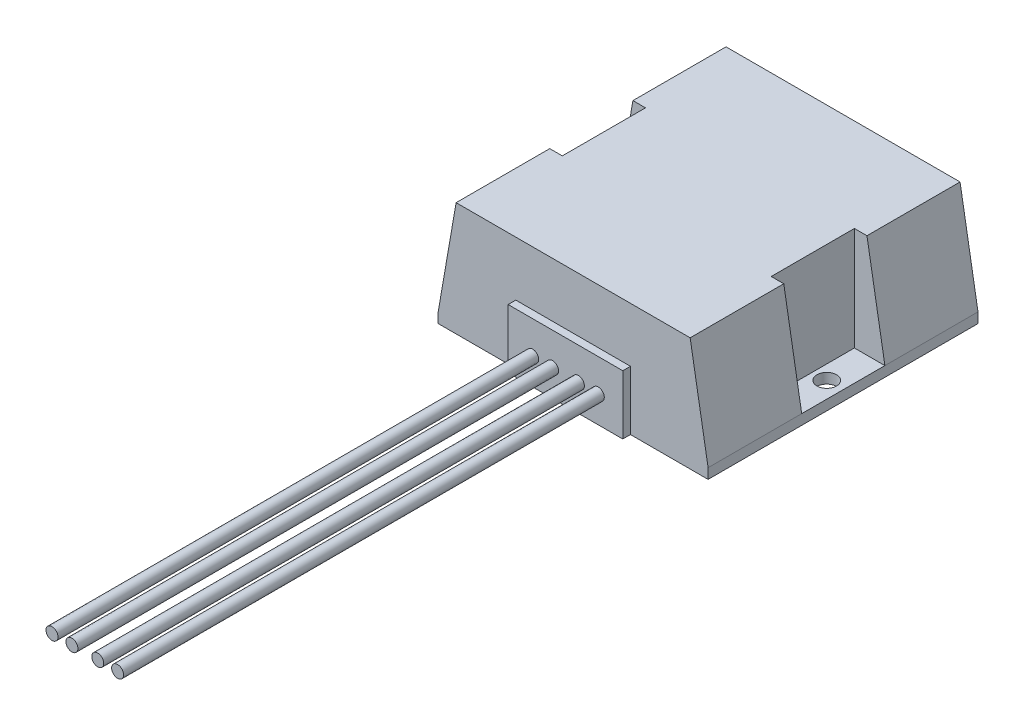
ISO-10303-21;
HEADER;
FILE_DESCRIPTION(('STEP AP214'),'2;1');
FILE_NAME('part.step','',(''),(''),'','','');
FILE_SCHEMA(('AUTOMOTIVE_DESIGN { 1 0 10303 214 1 1 1 1 }'));
ENDSEC;
DATA;
#1=APPLICATION_CONTEXT('core data for automotive mechanical design processes');
#2=APPLICATION_PROTOCOL_DEFINITION('international standard','automotive_design',2000,#1);
#3=PRODUCT_CONTEXT('',#1,'mechanical');
#4=PRODUCT('Part','Part','',(#3));
#5=PRODUCT_RELATED_PRODUCT_CATEGORY('part','',(#4));
#6=PRODUCT_DEFINITION_FORMATION('','',#4);
#7=PRODUCT_DEFINITION_CONTEXT('part definition',#1,'design');
#8=PRODUCT_DEFINITION('design','',#6,#7);
#9=PRODUCT_DEFINITION_SHAPE('','',#8);
#10=(LENGTH_UNIT() NAMED_UNIT(*) SI_UNIT(.MILLI.,.METRE.));
#11=(NAMED_UNIT(*) PLANE_ANGLE_UNIT() SI_UNIT($,.RADIAN.));
#12=(NAMED_UNIT(*) SI_UNIT($,.STERADIAN.) SOLID_ANGLE_UNIT());
#13=UNCERTAINTY_MEASURE_WITH_UNIT(LENGTH_MEASURE(1.E-05),#10,'distance_accuracy_value','');
#14=(GEOMETRIC_REPRESENTATION_CONTEXT(3) GLOBAL_UNCERTAINTY_ASSIGNED_CONTEXT((#13)) GLOBAL_UNIT_ASSIGNED_CONTEXT((#10,
#11,#12)) REPRESENTATION_CONTEXT('',''));
#15=CARTESIAN_POINT('',(0.,0.,0.));
#16=DIRECTION('',(0.,0.,1.));
#17=DIRECTION('',(1.,0.,0.));
#18=AXIS2_PLACEMENT_3D('',#15,#16,#17);
#19=CARTESIAN_POINT('',(-9.017,7.366,171.2722));
#20=DIRECTION('',(0.,0.,-1.));
#21=DIRECTION('',(-1.,0.,0.));
#22=AXIS2_PLACEMENT_3D('',#19,#20,#21);
#23=CYLINDRICAL_SURFACE('',#22,1.651);
#24=CARTESIAN_POINT('',(-9.017,7.366,171.2722));
#25=DIRECTION('',(0.,0.,1.));
#26=DIRECTION('',(1.,0.,0.));
#27=AXIS2_PLACEMENT_3D('',#24,#25,#26);
#28=CIRCLE('',#27,1.651);
#29=CARTESIAN_POINT('',(-7.366,7.366,171.2722));
#30=VERTEX_POINT('',#29);
#31=EDGE_CURVE('E11',#30,#30,#28,.T.);
#32=ORIENTED_EDGE('',*,*,#31,.F.);
#33=EDGE_LOOP('',(#32));
#34=FACE_BOUND('',#33,.T.);
#35=CARTESIAN_POINT('',(-9.017,7.366,39.1922));
#36=DIRECTION('',(0.,0.,1.));
#37=DIRECTION('',(1.,0.,0.));
#38=AXIS2_PLACEMENT_3D('',#35,#36,#37);
#39=CIRCLE('',#38,1.651);
#40=CARTESIAN_POINT('',(-7.366,7.366,39.1922));
#41=VERTEX_POINT('',#40);
#42=EDGE_CURVE('E49',#41,#41,#39,.T.);
#43=ORIENTED_EDGE('',*,*,#42,.T.);
#44=EDGE_LOOP('',(#43));
#45=FACE_BOUND('',#44,.T.);
#46=ADVANCED_FACE('F46',(#34,#45),#23,.T.);
#47=CARTESIAN_POINT('',(-9.017,7.366,171.2722));
#48=DIRECTION('',(0.,0.,1.));
#49=DIRECTION('',(1.,0.,0.));
#50=AXIS2_PLACEMENT_3D('',#47,#48,#49);
#51=PLANE('',#50);
#52=ORIENTED_EDGE('',*,*,#31,.T.);
#53=EDGE_LOOP('',(#52));
#54=FACE_BOUND('',#53,.T.);
#55=ADVANCED_FACE('F61',(#54),#51,.T.);
#56=CARTESIAN_POINT('',(-9.017,7.366,39.1922));
#57=DIRECTION('',(0.,0.,1.));
#58=DIRECTION('',(1.,0.,0.));
#59=AXIS2_PLACEMENT_3D('',#56,#57,#58);
#60=PLANE('',#59);
#61=ORIENTED_EDGE('',*,*,#42,.F.);
#62=EDGE_LOOP('',(#61));
#63=FACE_BOUND('',#62,.T.);
#64=ADVANCED_FACE('F59',(#63),#60,.F.);
#65=CLOSED_SHELL('',(#46,#55,#64));
#66=MANIFOLD_SOLID_BREP('B2',#65);
#67=CARTESIAN_POINT('',(-3.556,7.366,171.2722));
#68=DIRECTION('',(0.,0.,-1.));
#69=DIRECTION('',(-1.,0.,0.));
#70=AXIS2_PLACEMENT_3D('',#67,#68,#69);
#71=CYLINDRICAL_SURFACE('',#70,1.651);
#72=CARTESIAN_POINT('',(-3.556,7.366,171.2722));
#73=DIRECTION('',(0.,0.,1.));
#74=DIRECTION('',(1.,0.,0.));
#75=AXIS2_PLACEMENT_3D('',#72,#73,#74);
#76=CIRCLE('',#75,1.651);
#77=CARTESIAN_POINT('',(-1.905,7.366,171.2722));
#78=VERTEX_POINT('',#77);
#79=EDGE_CURVE('E45',#78,#78,#76,.T.);
#80=ORIENTED_EDGE('',*,*,#79,.F.);
#81=EDGE_LOOP('',(#80));
#82=FACE_BOUND('',#81,.T.);
#83=CARTESIAN_POINT('',(-3.556,7.366,39.1922));
#84=DIRECTION('',(0.,0.,1.));
#85=DIRECTION('',(1.,0.,0.));
#86=AXIS2_PLACEMENT_3D('',#83,#84,#85);
#87=CIRCLE('',#86,1.651);
#88=CARTESIAN_POINT('',(-1.905,7.366,39.1922));
#89=VERTEX_POINT('',#88);
#90=EDGE_CURVE('E99',#89,#89,#87,.T.);
#91=ORIENTED_EDGE('',*,*,#90,.T.);
#92=EDGE_LOOP('',(#91));
#93=FACE_BOUND('',#92,.T.);
#94=ADVANCED_FACE('F96',(#82,#93),#71,.T.);
#95=CARTESIAN_POINT('',(-3.556,7.366,171.2722));
#96=DIRECTION('',(0.,0.,1.));
#97=DIRECTION('',(1.,0.,0.));
#98=AXIS2_PLACEMENT_3D('',#95,#96,#97);
#99=PLANE('',#98);
#100=ORIENTED_EDGE('',*,*,#79,.T.);
#101=EDGE_LOOP('',(#100));
#102=FACE_BOUND('',#101,.T.);
#103=ADVANCED_FACE('F111',(#102),#99,.T.);
#104=CARTESIAN_POINT('',(-3.556,7.366,39.1922));
#105=DIRECTION('',(0.,0.,1.));
#106=DIRECTION('',(1.,0.,0.));
#107=AXIS2_PLACEMENT_3D('',#104,#105,#106);
#108=PLANE('',#107);
#109=ORIENTED_EDGE('',*,*,#90,.F.);
#110=EDGE_LOOP('',(#109));
#111=FACE_BOUND('',#110,.T.);
#112=ADVANCED_FACE('F109',(#111),#108,.F.);
#113=CLOSED_SHELL('',(#94,#103,#112));
#114=MANIFOLD_SOLID_BREP('B6',#113);
#115=CARTESIAN_POINT('',(0.,0.,37.084));
#116=DIRECTION('',(0.,0.,-1.));
#117=DIRECTION('',(-1.,0.,0.));
#118=AXIS2_PLACEMENT_3D('',#115,#116,#117);
#119=PLANE('',#118);
#120=DIRECTION('',(0.,-1.,0.));
#121=VECTOR('',#120,1.);
#122=CARTESIAN_POINT('',(-15.748,0.,37.084));
#123=LINE('',#122,#121);
#124=CARTESIAN_POINT('',(-15.748,16.256,37.084));
#125=VERTEX_POINT('',#124);
#126=CARTESIAN_POINT('',(-15.748,0.,37.084));
#127=VERTEX_POINT('',#126);
#128=EDGE_CURVE('E153',#125,#127,#123,.T.);
#129=ORIENTED_EDGE('',*,*,#128,.F.);
#130=DIRECTION('',(-1.,0.,0.));
#131=VECTOR('',#130,1.);
#132=CARTESIAN_POINT('',(-15.748,16.256,37.084));
#133=LINE('',#132,#131);
#134=CARTESIAN_POINT('',(15.748,16.256,37.084));
#135=VERTEX_POINT('',#134);
#136=EDGE_CURVE('E298',#135,#125,#133,.T.);
#137=ORIENTED_EDGE('',*,*,#136,.F.);
#138=DIRECTION('',(0.,1.,0.));
#139=VECTOR('',#138,1.);
#140=CARTESIAN_POINT('',(15.748,16.256,37.084));
#141=LINE('',#140,#139);
#142=CARTESIAN_POINT('',(15.748,0.,37.084));
#143=VERTEX_POINT('',#142);
#144=EDGE_CURVE('E159',#143,#135,#141,.T.);
#145=ORIENTED_EDGE('',*,*,#144,.F.);
#146=DIRECTION('',(1.,0.,0.));
#147=VECTOR('',#146,1.);
#148=CARTESIAN_POINT('',(0.,0.,37.084));
#149=LINE('',#148,#147);
#150=CARTESIAN_POINT('',(37.084,0.,37.084));
#151=VERTEX_POINT('',#150);
#152=EDGE_CURVE('E277',#143,#151,#149,.T.);
#153=ORIENTED_EDGE('',*,*,#152,.T.);
#154=DIRECTION('',(0.,1.,0.));
#155=VECTOR('',#154,1.);
#156=CARTESIAN_POINT('',(37.084,0.,37.084));
#157=LINE('',#156,#155);
#158=CARTESIAN_POINT('',(37.084,2.794,37.084));
#159=VERTEX_POINT('',#158);
#160=EDGE_CURVE('E398',#151,#159,#157,.T.);
#161=ORIENTED_EDGE('',*,*,#160,.T.);
#162=DIRECTION('',(-0.170672842917901,0.985327752928091,0.));
#163=VECTOR('',#162,1.);
#164=CARTESIAN_POINT('',(32.1564,31.242,37.084));
#165=LINE('',#164,#163);
#166=CARTESIAN_POINT('',(32.1564,31.242,37.084));
#167=VERTEX_POINT('',#166);
#168=EDGE_CURVE('E401',#159,#167,#165,.T.);
#169=ORIENTED_EDGE('',*,*,#168,.T.);
#170=DIRECTION('',(-1.,0.,0.));
#171=VECTOR('',#170,1.);
#172=CARTESIAN_POINT('',(0.,31.242,37.084));
#173=LINE('',#172,#171);
#174=CARTESIAN_POINT('',(-32.1564,31.242,37.084));
#175=VERTEX_POINT('',#174);
#176=EDGE_CURVE('E404',#167,#175,#173,.T.);
#177=ORIENTED_EDGE('',*,*,#176,.T.);
#178=DIRECTION('',(-0.170672842917901,-0.985327752928091,0.));
#179=VECTOR('',#178,1.);
#180=CARTESIAN_POINT('',(-32.1564,31.242,37.084));
#181=LINE('',#180,#179);
#182=CARTESIAN_POINT('',(-37.084,2.794,37.084));
#183=VERTEX_POINT('',#182);
#184=EDGE_CURVE('E407',#175,#183,#181,.T.);
#185=ORIENTED_EDGE('',*,*,#184,.T.);
#186=DIRECTION('',(0.,-1.,0.));
#187=VECTOR('',#186,1.);
#188=CARTESIAN_POINT('',(-37.084,0.,37.084));
#189=LINE('',#188,#187);
#190=CARTESIAN_POINT('',(-37.084,0.,37.084));
#191=VERTEX_POINT('',#190);
#192=EDGE_CURVE('E410',#183,#191,#189,.T.);
#193=ORIENTED_EDGE('',*,*,#192,.T.);
#194=EDGE_CURVE('E395',#191,#127,#149,.T.);
#195=ORIENTED_EDGE('',*,*,#194,.T.);
#196=EDGE_LOOP('',(#129,#137,#145,#153,#161,#169,#177,#185,#193,#195));
#197=FACE_BOUND('',#196,.T.);
#198=ADVANCED_FACE('F137',(#197),#119,.F.);
#199=CARTESIAN_POINT('',(-32.1564,31.242,37.084));
#200=DIRECTION('',(0.985327752928091,-0.170672842917901,0.));
#201=DIRECTION('',(0.170672842917901,0.985327752928091,0.));
#202=AXIS2_PLACEMENT_3D('',#199,#200,#201);
#203=PLANE('',#202);
#204=DIRECTION('',(0.,0.,-1.));
#205=VECTOR('',#204,1.);
#206=CARTESIAN_POINT('',(-32.1564,31.242,37.084));
#207=LINE('',#206,#205);
#208=CARTESIAN_POINT('',(-32.1564,31.242,11.3615373120134));
#209=VERTEX_POINT('',#208);
#210=EDGE_CURVE('E445',#175,#209,#207,.T.);
#211=ORIENTED_EDGE('',*,*,#210,.T.);
#212=DIRECTION('',(-0.170672842917901,-0.985327752928091,0.));
#213=VECTOR('',#212,1.);
#214=CARTESIAN_POINT('',(-32.1564,31.242,11.3615373120134));
#215=LINE('',#214,#213);
#216=CARTESIAN_POINT('',(-37.084,2.794,11.3615373120134));
#217=VERTEX_POINT('',#216);
#218=EDGE_CURVE('E470',#209,#217,#215,.T.);
#219=ORIENTED_EDGE('',*,*,#218,.T.);
#220=DIRECTION('',(0.,0.,-1.));
#221=VECTOR('',#220,1.);
#222=CARTESIAN_POINT('',(-37.084,2.794,37.084));
#223=LINE('',#222,#221);
#224=EDGE_CURVE('E440',#183,#217,#223,.T.);
#225=ORIENTED_EDGE('',*,*,#224,.F.);
#226=ORIENTED_EDGE('',*,*,#184,.F.);
#227=EDGE_LOOP('',(#211,#219,#225,#226));
#228=FACE_BOUND('',#227,.T.);
#229=ADVANCED_FACE('F496',(#228),#203,.F.);
#230=CARTESIAN_POINT('',(32.1564,31.242,37.084));
#231=DIRECTION('',(-0.985327752928091,-0.170672842917901,0.));
#232=DIRECTION('',(0.170672842917901,-0.985327752928091,0.));
#233=AXIS2_PLACEMENT_3D('',#230,#231,#232);
#234=PLANE('',#233);
#235=DIRECTION('',(0.170672842917901,-0.985327752928091,0.));
#236=VECTOR('',#235,1.);
#237=CARTESIAN_POINT('',(32.1564,31.242,11.3615373120134));
#238=LINE('',#237,#236);
#239=CARTESIAN_POINT('',(32.1564,31.242,11.3615373120134));
#240=VERTEX_POINT('',#239);
#241=CARTESIAN_POINT('',(37.084,2.794,11.3615373120134));
#242=VERTEX_POINT('',#241);
#243=EDGE_CURVE('E391',#240,#242,#238,.T.);
#244=ORIENTED_EDGE('',*,*,#243,.F.);
#245=DIRECTION('',(0.,0.,-1.));
#246=VECTOR('',#245,1.);
#247=CARTESIAN_POINT('',(32.1564,31.242,37.084));
#248=LINE('',#247,#246);
#249=EDGE_CURVE('E450',#167,#240,#248,.T.);
#250=ORIENTED_EDGE('',*,*,#249,.F.);
#251=ORIENTED_EDGE('',*,*,#168,.F.);
#252=DIRECTION('',(0.,0.,-1.));
#253=VECTOR('',#252,1.);
#254=CARTESIAN_POINT('',(37.084,2.794,37.084));
#255=LINE('',#254,#253);
#256=EDGE_CURVE('E455',#159,#242,#255,.T.);
#257=ORIENTED_EDGE('',*,*,#256,.T.);
#258=EDGE_LOOP('',(#244,#250,#251,#257));
#259=FACE_BOUND('',#258,.T.);
#260=ADVANCED_FACE('F501',(#259),#234,.F.);
#261=DIRECTION('',(-0.170672842917901,0.985327752928091,0.));
#262=VECTOR('',#261,1.);
#263=CARTESIAN_POINT('',(32.1564,31.242,-11.4984626879866));
#264=LINE('',#263,#262);
#265=CARTESIAN_POINT('',(37.084,2.794,-11.4984626879866));
#266=VERTEX_POINT('',#265);
#267=CARTESIAN_POINT('',(32.1564,31.242,-11.4984626879866));
#268=VERTEX_POINT('',#267);
#269=EDGE_CURVE('E368',#266,#268,#264,.T.);
#270=ORIENTED_EDGE('',*,*,#269,.F.);
#271=CARTESIAN_POINT('',(37.084,2.794,-37.084));
#272=VERTEX_POINT('',#271);
#273=EDGE_CURVE('E454',#266,#272,#255,.T.);
#274=ORIENTED_EDGE('',*,*,#273,.T.);
#275=DIRECTION('',(-0.170672842917901,0.985327752928091,0.));
#276=VECTOR('',#275,1.);
#277=CARTESIAN_POINT('',(32.1564,31.242,-37.084));
#278=LINE('',#277,#276);
#279=CARTESIAN_POINT('',(32.1564,31.242,-37.084));
#280=VERTEX_POINT('',#279);
#281=EDGE_CURVE('E420',#272,#280,#278,.T.);
#282=ORIENTED_EDGE('',*,*,#281,.T.);
#283=EDGE_CURVE('E449',#268,#280,#248,.T.);
#284=ORIENTED_EDGE('',*,*,#283,.F.);
#285=EDGE_LOOP('',(#270,#274,#282,#284));
#286=FACE_BOUND('',#285,.T.);
#287=ADVANCED_FACE('F524',(#286),#234,.F.);
#288=CARTESIAN_POINT('',(0.,31.242,37.084));
#289=DIRECTION('',(0.,-1.,0.));
#290=DIRECTION('',(1.,0.,0.));
#291=AXIS2_PLACEMENT_3D('',#288,#289,#290);
#292=PLANE('',#291);
#293=DIRECTION('',(0.,0.,-1.));
#294=VECTOR('',#293,1.);
#295=CARTESIAN_POINT('',(-28.702,31.242,-11.4984626879866));
#296=LINE('',#295,#294);
#297=CARTESIAN_POINT('',(-28.702,31.242,11.3615373120134));
#298=VERTEX_POINT('',#297);
#299=CARTESIAN_POINT('',(-28.702,31.242,-11.4984626879866));
#300=VERTEX_POINT('',#299);
#301=EDGE_CURVE('E312',#298,#300,#296,.T.);
#302=ORIENTED_EDGE('',*,*,#301,.F.);
#303=DIRECTION('',(1.,0.,0.));
#304=VECTOR('',#303,1.);
#305=CARTESIAN_POINT('',(-37.084,31.242,11.3615373120134));
#306=LINE('',#305,#304);
#307=EDGE_CURVE('E315',#209,#298,#306,.T.);
#308=ORIENTED_EDGE('',*,*,#307,.F.);
#309=ORIENTED_EDGE('',*,*,#210,.F.);
#310=ORIENTED_EDGE('',*,*,#176,.F.);
#311=ORIENTED_EDGE('',*,*,#249,.T.);
#312=DIRECTION('',(1.,0.,0.));
#313=VECTOR('',#312,1.);
#314=CARTESIAN_POINT('',(0.,31.242,11.3615373120134));
#315=LINE('',#314,#313);
#316=CARTESIAN_POINT('',(28.702,31.242,11.3615373120134));
#317=VERTEX_POINT('',#316);
#318=EDGE_CURVE('E463',#317,#240,#315,.T.);
#319=ORIENTED_EDGE('',*,*,#318,.F.);
#320=DIRECTION('',(0.,0.,-1.));
#321=VECTOR('',#320,1.);
#322=CARTESIAN_POINT('',(28.702,31.242,-11.4984626879866));
#323=LINE('',#322,#321);
#324=CARTESIAN_POINT('',(28.702,31.242,-11.4984626879866));
#325=VERTEX_POINT('',#324);
#326=EDGE_CURVE('E359',#317,#325,#323,.T.);
#327=ORIENTED_EDGE('',*,*,#326,.T.);
#328=DIRECTION('',(1.,0.,0.));
#329=VECTOR('',#328,1.);
#330=CARTESIAN_POINT('',(37.084,31.242,-11.4984626879866));
#331=LINE('',#330,#329);
#332=EDGE_CURVE('E363',#325,#268,#331,.T.);
#333=ORIENTED_EDGE('',*,*,#332,.T.);
#334=ORIENTED_EDGE('',*,*,#283,.T.);
#335=DIRECTION('',(-1.,0.,0.));
#336=VECTOR('',#335,1.);
#337=CARTESIAN_POINT('',(0.,31.242,-37.084));
#338=LINE('',#337,#336);
#339=CARTESIAN_POINT('',(-32.1564,31.242,-37.084));
#340=VERTEX_POINT('',#339);
#341=EDGE_CURVE('E424',#280,#340,#338,.T.);
#342=ORIENTED_EDGE('',*,*,#341,.T.);
#343=CARTESIAN_POINT('',(-32.1564,31.242,-11.4984626879866));
#344=VERTEX_POINT('',#343);
#345=EDGE_CURVE('E444',#344,#340,#207,.T.);
#346=ORIENTED_EDGE('',*,*,#345,.F.);
#347=DIRECTION('',(-1.,0.,0.));
#348=VECTOR('',#347,1.);
#349=CARTESIAN_POINT('',(-37.084,31.242,-11.4984626879866));
#350=LINE('',#349,#348);
#351=EDGE_CURVE('E319',#300,#344,#350,.T.);
#352=ORIENTED_EDGE('',*,*,#351,.F.);
#353=EDGE_LOOP('',(#302,#308,#309,#310,#311,#319,#327,#333,#334,#342,#346,#352));
#354=FACE_BOUND('',#353,.T.);
#355=ADVANCED_FACE('F521',(#354),#292,.F.);
#356=CARTESIAN_POINT('',(0.,0.,37.084));
#357=DIRECTION('',(0.,1.,0.));
#358=DIRECTION('',(0.,0.,1.));
#359=AXIS2_PLACEMENT_3D('',#356,#357,#358);
#360=PLANE('',#359);
#361=CARTESIAN_POINT('',(-32.6141242723814,0.,0.));
#362=DIRECTION('',(0.,-1.,0.));
#363=DIRECTION('',(0.,0.,1.));
#364=AXIS2_PLACEMENT_3D('',#361,#362,#363);
#365=CIRCLE('',#364,2.6924);
#366=CARTESIAN_POINT('',(-32.6141242723814,0.,2.6924));
#367=VERTEX_POINT('',#366);
#368=EDGE_CURVE('E343',#367,#367,#365,.T.);
#369=ORIENTED_EDGE('',*,*,#368,.F.);
#370=EDGE_LOOP('',(#369));
#371=FACE_BOUND('',#370,.T.);
#372=CARTESIAN_POINT('',(32.6141242723814,0.,0.));
#373=DIRECTION('',(0.,1.,0.));
#374=DIRECTION('',(0.,0.,1.));
#375=AXIS2_PLACEMENT_3D('',#372,#373,#374);
#376=CIRCLE('',#375,2.6924);
#377=CARTESIAN_POINT('',(32.6141242723814,0.,2.6924));
#378=VERTEX_POINT('',#377);
#379=EDGE_CURVE('E351',#378,#378,#376,.T.);
#380=ORIENTED_EDGE('',*,*,#379,.T.);
#381=EDGE_LOOP('',(#380));
#382=FACE_BOUND('',#381,.T.);
#383=DIRECTION('',(1.,0.,0.));
#384=VECTOR('',#383,1.);
#385=CARTESIAN_POINT('',(0.,0.,-37.084));
#386=LINE('',#385,#384);
#387=CARTESIAN_POINT('',(-37.084,0.,-37.084));
#388=VERTEX_POINT('',#387);
#389=CARTESIAN_POINT('',(37.084,0.,-37.084));
#390=VERTEX_POINT('',#389);
#391=EDGE_CURVE('E394',#388,#390,#386,.T.);
#392=ORIENTED_EDGE('',*,*,#391,.T.);
#393=DIRECTION('',(0.,0.,-1.));
#394=VECTOR('',#393,1.);
#395=CARTESIAN_POINT('',(37.084,0.,37.084));
#396=LINE('',#395,#394);
#397=EDGE_CURVE('E459',#151,#390,#396,.T.);
#398=ORIENTED_EDGE('',*,*,#397,.F.);
#399=ORIENTED_EDGE('',*,*,#152,.F.);
#400=DIRECTION('',(0.,0.,-1.));
#401=VECTOR('',#400,1.);
#402=CARTESIAN_POINT('',(15.748,0.,39.1922));
#403=LINE('',#402,#401);
#404=CARTESIAN_POINT('',(15.748,0.,39.1922));
#405=VERTEX_POINT('',#404);
#406=EDGE_CURVE('E275',#405,#143,#403,.T.);
#407=ORIENTED_EDGE('',*,*,#406,.F.);
#408=DIRECTION('',(1.,0.,0.));
#409=VECTOR('',#408,1.);
#410=CARTESIAN_POINT('',(0.,0.,39.1922));
#411=LINE('',#410,#409);
#412=CARTESIAN_POINT('',(-15.748,0.,39.1922));
#413=VERTEX_POINT('',#412);
#414=EDGE_CURVE('E261',#413,#405,#411,.T.);
#415=ORIENTED_EDGE('',*,*,#414,.F.);
#416=DIRECTION('',(0.,0.,-1.));
#417=VECTOR('',#416,1.);
#418=CARTESIAN_POINT('',(-15.748,0.,39.1922));
#419=LINE('',#418,#417);
#420=EDGE_CURVE('E295',#413,#127,#419,.T.);
#421=ORIENTED_EDGE('',*,*,#420,.T.);
#422=ORIENTED_EDGE('',*,*,#194,.F.);
#423=DIRECTION('',(0.,0.,-1.));
#424=VECTOR('',#423,1.);
#425=CARTESIAN_POINT('',(-37.084,0.,37.084));
#426=LINE('',#425,#424);
#427=EDGE_CURVE('E413',#191,#388,#426,.T.);
#428=ORIENTED_EDGE('',*,*,#427,.T.);
#429=EDGE_LOOP('',(#392,#398,#399,#407,#415,#421,#422,#428));
#430=FACE_BOUND('',#429,.T.);
#431=ADVANCED_FACE('F139',(#371,#382,#430),#360,.F.);
#432=CARTESIAN_POINT('',(37.084,0.,37.084));
#433=DIRECTION('',(-1.,0.,0.));
#434=DIRECTION('',(0.,0.,1.));
#435=AXIS2_PLACEMENT_3D('',#432,#433,#434);
#436=PLANE('',#435);
#437=DIRECTION('',(0.,1.,0.));
#438=VECTOR('',#437,1.);
#439=CARTESIAN_POINT('',(37.084,0.,-37.084));
#440=LINE('',#439,#438);
#441=EDGE_CURVE('E416',#390,#272,#440,.T.);
#442=ORIENTED_EDGE('',*,*,#441,.T.);
#443=ORIENTED_EDGE('',*,*,#273,.F.);
#444=DIRECTION('',(0.,0.,-1.));
#445=VECTOR('',#444,1.);
#446=CARTESIAN_POINT('',(37.084,2.794,-11.4984626879866));
#447=LINE('',#446,#445);
#448=EDGE_CURVE('E355',#242,#266,#447,.T.);
#449=ORIENTED_EDGE('',*,*,#448,.F.);
#450=ORIENTED_EDGE('',*,*,#256,.F.);
#451=ORIENTED_EDGE('',*,*,#160,.F.);
#452=ORIENTED_EDGE('',*,*,#397,.T.);
#453=EDGE_LOOP('',(#442,#443,#449,#450,#451,#452));
#454=FACE_BOUND('',#453,.T.);
#455=ADVANCED_FACE('F519',(#454),#436,.F.);
#456=CARTESIAN_POINT('',(-37.084,2.794,-11.4984626879866));
#457=VERTEX_POINT('',#456);
#458=CARTESIAN_POINT('',(-37.084,2.794,-37.084));
#459=VERTEX_POINT('',#458);
#460=EDGE_CURVE('E439',#457,#459,#223,.T.);
#461=ORIENTED_EDGE('',*,*,#460,.F.);
#462=DIRECTION('',(0.170672842917901,0.985327752928091,0.));
#463=VECTOR('',#462,1.);
#464=CARTESIAN_POINT('',(-32.1564,31.242,-11.4984626879866));
#465=LINE('',#464,#463);
#466=EDGE_CURVE('E466',#457,#344,#465,.T.);
#467=ORIENTED_EDGE('',*,*,#466,.T.);
#468=ORIENTED_EDGE('',*,*,#345,.T.);
#469=DIRECTION('',(-0.170672842917901,-0.985327752928091,0.));
#470=VECTOR('',#469,1.);
#471=CARTESIAN_POINT('',(-32.1564,31.242,-37.084));
#472=LINE('',#471,#470);
#473=EDGE_CURVE('E428',#340,#459,#472,.T.);
#474=ORIENTED_EDGE('',*,*,#473,.T.);
#475=EDGE_LOOP('',(#461,#467,#468,#474));
#476=FACE_BOUND('',#475,.T.);
#477=ADVANCED_FACE('F504',(#476),#203,.F.);
#478=CARTESIAN_POINT('',(-37.084,0.,37.084));
#479=DIRECTION('',(1.,0.,0.));
#480=DIRECTION('',(0.,0.,-1.));
#481=AXIS2_PLACEMENT_3D('',#478,#479,#480);
#482=PLANE('',#481);
#483=DIRECTION('',(0.,-1.,0.));
#484=VECTOR('',#483,1.);
#485=CARTESIAN_POINT('',(-37.084,0.,-37.084));
#486=LINE('',#485,#484);
#487=EDGE_CURVE('E432',#459,#388,#486,.T.);
#488=ORIENTED_EDGE('',*,*,#487,.T.);
#489=ORIENTED_EDGE('',*,*,#427,.F.);
#490=ORIENTED_EDGE('',*,*,#192,.F.);
#491=ORIENTED_EDGE('',*,*,#224,.T.);
#492=DIRECTION('',(0.,0.,-1.));
#493=VECTOR('',#492,1.);
#494=CARTESIAN_POINT('',(-37.084,2.794,-11.4984626879866));
#495=LINE('',#494,#493);
#496=EDGE_CURVE('E280',#217,#457,#495,.T.);
#497=ORIENTED_EDGE('',*,*,#496,.T.);
#498=ORIENTED_EDGE('',*,*,#460,.T.);
#499=EDGE_LOOP('',(#488,#489,#490,#491,#497,#498));
#500=FACE_BOUND('',#499,.T.);
#501=ADVANCED_FACE('F513',(#500),#482,.F.);
#502=CARTESIAN_POINT('',(0.,0.,-37.084));
#503=DIRECTION('',(0.,0.,-1.));
#504=DIRECTION('',(-1.,0.,0.));
#505=AXIS2_PLACEMENT_3D('',#502,#503,#504);
#506=PLANE('',#505);
#507=ORIENTED_EDGE('',*,*,#391,.F.);
#508=ORIENTED_EDGE('',*,*,#487,.F.);
#509=ORIENTED_EDGE('',*,*,#473,.F.);
#510=ORIENTED_EDGE('',*,*,#341,.F.);
#511=ORIENTED_EDGE('',*,*,#281,.F.);
#512=ORIENTED_EDGE('',*,*,#441,.F.);
#513=EDGE_LOOP('',(#507,#508,#509,#510,#511,#512));
#514=FACE_BOUND('',#513,.T.);
#515=ADVANCED_FACE('F509',(#514),#506,.T.);
#516=CARTESIAN_POINT('',(37.084,55.5902550504138,11.3615373120134));
#517=DIRECTION('',(0.,0.,-1.));
#518=DIRECTION('',(-1.,0.,0.));
#519=AXIS2_PLACEMENT_3D('',#516,#517,#518);
#520=PLANE('',#519);
#521=ORIENTED_EDGE('',*,*,#243,.T.);
#522=DIRECTION('',(1.,0.,0.));
#523=VECTOR('',#522,1.);
#524=CARTESIAN_POINT('',(37.084,2.794,11.3615373120134));
#525=LINE('',#524,#523);
#526=CARTESIAN_POINT('',(28.702,2.794,11.3615373120134));
#527=VERTEX_POINT('',#526);
#528=EDGE_CURVE('E380',#527,#242,#525,.T.);
#529=ORIENTED_EDGE('',*,*,#528,.F.);
#530=DIRECTION('',(0.,-1.,0.));
#531=VECTOR('',#530,1.);
#532=CARTESIAN_POINT('',(28.702,55.5902550504138,11.3615373120134));
#533=LINE('',#532,#531);
#534=EDGE_CURVE('E384',#317,#527,#533,.T.);
#535=ORIENTED_EDGE('',*,*,#534,.F.);
#536=ORIENTED_EDGE('',*,*,#318,.T.);
#537=EDGE_LOOP('',(#521,#529,#535,#536));
#538=FACE_BOUND('',#537,.T.);
#539=ADVANCED_FACE('F512',(#538),#520,.T.);
#540=CARTESIAN_POINT('',(37.084,55.5902550504138,-11.4984626879866));
#541=DIRECTION('',(0.,0.,1.));
#542=DIRECTION('',(1.,0.,0.));
#543=AXIS2_PLACEMENT_3D('',#540,#541,#542);
#544=PLANE('',#543);
#545=ORIENTED_EDGE('',*,*,#269,.T.);
#546=ORIENTED_EDGE('',*,*,#332,.F.);
#547=DIRECTION('',(0.,-1.,0.));
#548=VECTOR('',#547,1.);
#549=CARTESIAN_POINT('',(28.702,55.5902550504138,-11.4984626879866));
#550=LINE('',#549,#548);
#551=CARTESIAN_POINT('',(28.702,2.794,-11.4984626879866));
#552=VERTEX_POINT('',#551);
#553=EDGE_CURVE('E364',#325,#552,#550,.T.);
#554=ORIENTED_EDGE('',*,*,#553,.T.);
#555=DIRECTION('',(-1.,0.,0.));
#556=VECTOR('',#555,1.);
#557=CARTESIAN_POINT('',(37.084,2.794,-11.4984626879866));
#558=LINE('',#557,#556);
#559=EDGE_CURVE('E372',#266,#552,#558,.T.);
#560=ORIENTED_EDGE('',*,*,#559,.F.);
#561=EDGE_LOOP('',(#545,#546,#554,#560));
#562=FACE_BOUND('',#561,.T.);
#563=ADVANCED_FACE('F507',(#562),#544,.T.);
#564=CARTESIAN_POINT('',(0.,2.794,0.));
#565=DIRECTION('',(0.,-1.,0.));
#566=DIRECTION('',(0.,0.,-1.));
#567=AXIS2_PLACEMENT_3D('',#564,#565,#566);
#568=PLANE('',#567);
#569=CARTESIAN_POINT('',(32.6141242723814,2.794,0.));
#570=DIRECTION('',(0.,1.,0.));
#571=DIRECTION('',(0.,0.,1.));
#572=AXIS2_PLACEMENT_3D('',#569,#570,#571);
#573=CIRCLE('',#572,2.6924);
#574=CARTESIAN_POINT('',(32.6141242723814,2.794,2.6924));
#575=VERTEX_POINT('',#574);
#576=EDGE_CURVE('E347',#575,#575,#573,.T.);
#577=ORIENTED_EDGE('',*,*,#576,.F.);
#578=EDGE_LOOP('',(#577));
#579=FACE_BOUND('',#578,.T.);
#580=ORIENTED_EDGE('',*,*,#448,.T.);
#581=ORIENTED_EDGE('',*,*,#559,.T.);
#582=DIRECTION('',(0.,0.,1.));
#583=VECTOR('',#582,1.);
#584=CARTESIAN_POINT('',(28.702,2.794,-11.4984626879866));
#585=LINE('',#584,#583);
#586=EDGE_CURVE('E376',#552,#527,#585,.T.);
#587=ORIENTED_EDGE('',*,*,#586,.T.);
#588=ORIENTED_EDGE('',*,*,#528,.T.);
#589=EDGE_LOOP('',(#580,#581,#587,#588));
#590=FACE_BOUND('',#589,.T.);
#591=ADVANCED_FACE('F596',(#579,#590),#568,.F.);
#592=CARTESIAN_POINT('',(28.702,55.5902550504138,-11.4984626879866));
#593=DIRECTION('',(1.,0.,0.));
#594=DIRECTION('',(0.,0.,-1.));
#595=AXIS2_PLACEMENT_3D('',#592,#593,#594);
#596=PLANE('',#595);
#597=ORIENTED_EDGE('',*,*,#534,.T.);
#598=ORIENTED_EDGE('',*,*,#586,.F.);
#599=ORIENTED_EDGE('',*,*,#553,.F.);
#600=ORIENTED_EDGE('',*,*,#326,.F.);
#601=EDGE_LOOP('',(#597,#598,#599,#600));
#602=FACE_BOUND('',#601,.T.);
#603=ADVANCED_FACE('F594',(#602),#596,.T.);
#604=CARTESIAN_POINT('',(32.6141242723814,0.,0.));
#605=DIRECTION('',(0.,1.,0.));
#606=DIRECTION('',(0.,0.,1.));
#607=AXIS2_PLACEMENT_3D('',#604,#605,#606);
#608=CYLINDRICAL_SURFACE('',#607,2.6924);
#609=ORIENTED_EDGE('',*,*,#379,.F.);
#610=EDGE_LOOP('',(#609));
#611=FACE_BOUND('',#610,.T.);
#612=ORIENTED_EDGE('',*,*,#576,.T.);
#613=EDGE_LOOP('',(#612));
#614=FACE_BOUND('',#613,.T.);
#615=ADVANCED_FACE('F590',(#611,#614),#608,.F.);
#616=CARTESIAN_POINT('',(-32.6141242723814,0.,0.));
#617=DIRECTION('',(0.,1.,0.));
#618=DIRECTION('',(0.,0.,1.));
#619=AXIS2_PLACEMENT_3D('',#616,#617,#618);
#620=CYLINDRICAL_SURFACE('',#619,2.6924);
#621=ORIENTED_EDGE('',*,*,#368,.T.);
#622=EDGE_LOOP('',(#621));
#623=FACE_BOUND('',#622,.T.);
#624=CARTESIAN_POINT('',(-32.6141242723814,2.794,0.));
#625=DIRECTION('',(0.,-1.,0.));
#626=DIRECTION('',(0.,0.,1.));
#627=AXIS2_PLACEMENT_3D('',#624,#625,#626);
#628=CIRCLE('',#627,2.6924);
#629=CARTESIAN_POINT('',(-32.6141242723814,2.794,2.6924));
#630=VERTEX_POINT('',#629);
#631=EDGE_CURVE('E342',#630,#630,#628,.T.);
#632=ORIENTED_EDGE('',*,*,#631,.F.);
#633=EDGE_LOOP('',(#632));
#634=FACE_BOUND('',#633,.T.);
#635=ADVANCED_FACE('F586',(#623,#634),#620,.F.);
#636=CARTESIAN_POINT('',(-37.084,55.5902550504138,11.3615373120134));
#637=DIRECTION('',(0.,0.,1.));
#638=DIRECTION('',(1.,0.,0.));
#639=AXIS2_PLACEMENT_3D('',#636,#637,#638);
#640=PLANE('',#639);
#641=ORIENTED_EDGE('',*,*,#307,.T.);
#642=DIRECTION('',(0.,-1.,0.));
#643=VECTOR('',#642,1.);
#644=CARTESIAN_POINT('',(-28.702,55.5902550504138,11.3615373120134));
#645=LINE('',#644,#643);
#646=CARTESIAN_POINT('',(-28.702,2.794,11.3615373120134));
#647=VERTEX_POINT('',#646);
#648=EDGE_CURVE('E316',#298,#647,#645,.T.);
#649=ORIENTED_EDGE('',*,*,#648,.T.);
#650=DIRECTION('',(-1.,0.,0.));
#651=VECTOR('',#650,1.);
#652=CARTESIAN_POINT('',(-37.084,2.794,11.3615373120134));
#653=LINE('',#652,#651);
#654=EDGE_CURVE('E323',#647,#217,#653,.T.);
#655=ORIENTED_EDGE('',*,*,#654,.T.);
#656=ORIENTED_EDGE('',*,*,#218,.F.);
#657=EDGE_LOOP('',(#641,#649,#655,#656));
#658=FACE_BOUND('',#657,.T.);
#659=ADVANCED_FACE('F579',(#658),#640,.F.);
#660=CARTESIAN_POINT('',(-37.084,55.5902550504138,-11.4984626879866));
#661=DIRECTION('',(0.,0.,-1.));
#662=DIRECTION('',(-1.,0.,0.));
#663=AXIS2_PLACEMENT_3D('',#660,#661,#662);
#664=PLANE('',#663);
#665=DIRECTION('',(1.,0.,0.));
#666=VECTOR('',#665,1.);
#667=CARTESIAN_POINT('',(-37.084,2.794,-11.4984626879866));
#668=LINE('',#667,#666);
#669=CARTESIAN_POINT('',(-28.702,2.794,-11.4984626879866));
#670=VERTEX_POINT('',#669);
#671=EDGE_CURVE('E331',#457,#670,#668,.T.);
#672=ORIENTED_EDGE('',*,*,#671,.T.);
#673=DIRECTION('',(0.,-1.,0.));
#674=VECTOR('',#673,1.);
#675=CARTESIAN_POINT('',(-28.702,55.5902550504138,-11.4984626879866));
#676=LINE('',#675,#674);
#677=EDGE_CURVE('E335',#300,#670,#676,.T.);
#678=ORIENTED_EDGE('',*,*,#677,.F.);
#679=ORIENTED_EDGE('',*,*,#351,.T.);
#680=ORIENTED_EDGE('',*,*,#466,.F.);
#681=EDGE_LOOP('',(#672,#678,#679,#680));
#682=FACE_BOUND('',#681,.T.);
#683=ADVANCED_FACE('F576',(#682),#664,.F.);
#684=CARTESIAN_POINT('',(-28.702,55.5902550504138,-11.4984626879866));
#685=DIRECTION('',(1.,0.,0.));
#686=DIRECTION('',(0.,0.,-1.));
#687=AXIS2_PLACEMENT_3D('',#684,#685,#686);
#688=PLANE('',#687);
#689=ORIENTED_EDGE('',*,*,#301,.T.);
#690=ORIENTED_EDGE('',*,*,#677,.T.);
#691=DIRECTION('',(0.,0.,1.));
#692=VECTOR('',#691,1.);
#693=CARTESIAN_POINT('',(-28.702,2.794,-11.4984626879866));
#694=LINE('',#693,#692);
#695=EDGE_CURVE('E327',#670,#647,#694,.T.);
#696=ORIENTED_EDGE('',*,*,#695,.T.);
#697=ORIENTED_EDGE('',*,*,#648,.F.);
#698=EDGE_LOOP('',(#689,#690,#696,#697));
#699=FACE_BOUND('',#698,.T.);
#700=ADVANCED_FACE('F574',(#699),#688,.F.);
#701=CARTESIAN_POINT('',(0.,2.794,0.));
#702=DIRECTION('',(0.,-1.,0.));
#703=DIRECTION('',(0.,0.,-1.));
#704=AXIS2_PLACEMENT_3D('',#701,#702,#703);
#705=PLANE('',#704);
#706=ORIENTED_EDGE('',*,*,#631,.T.);
#707=EDGE_LOOP('',(#706));
#708=FACE_BOUND('',#707,.T.);
#709=ORIENTED_EDGE('',*,*,#496,.F.);
#710=ORIENTED_EDGE('',*,*,#654,.F.);
#711=ORIENTED_EDGE('',*,*,#695,.F.);
#712=ORIENTED_EDGE('',*,*,#671,.F.);
#713=EDGE_LOOP('',(#709,#710,#711,#712));
#714=FACE_BOUND('',#713,.T.);
#715=ADVANCED_FACE('F569',(#708,#714),#705,.F.);
#716=CARTESIAN_POINT('',(15.748,16.256,39.1922));
#717=DIRECTION('',(-1.,0.,0.));
#718=DIRECTION('',(0.,0.,1.));
#719=AXIS2_PLACEMENT_3D('',#716,#717,#718);
#720=PLANE('',#719);
#721=ORIENTED_EDGE('',*,*,#144,.T.);
#722=DIRECTION('',(0.,0.,-1.));
#723=VECTOR('',#722,1.);
#724=CARTESIAN_POINT('',(15.748,16.256,39.1922));
#725=LINE('',#724,#723);
#726=CARTESIAN_POINT('',(15.748,16.256,39.1922));
#727=VERTEX_POINT('',#726);
#728=EDGE_CURVE('E281',#727,#135,#725,.T.);
#729=ORIENTED_EDGE('',*,*,#728,.F.);
#730=DIRECTION('',(0.,1.,0.));
#731=VECTOR('',#730,1.);
#732=CARTESIAN_POINT('',(15.748,16.256,39.1922));
#733=LINE('',#732,#731);
#734=EDGE_CURVE('E265',#405,#727,#733,.T.);
#735=ORIENTED_EDGE('',*,*,#734,.F.);
#736=ORIENTED_EDGE('',*,*,#406,.T.);
#737=EDGE_LOOP('',(#721,#729,#735,#736));
#738=FACE_BOUND('',#737,.T.);
#739=ADVANCED_FACE('F283',(#738),#720,.F.);
#740=CARTESIAN_POINT('',(-15.748,16.256,39.1922));
#741=DIRECTION('',(0.,-1.,0.));
#742=DIRECTION('',(0.,0.,-1.));
#743=AXIS2_PLACEMENT_3D('',#740,#741,#742);
#744=PLANE('',#743);
#745=ORIENTED_EDGE('',*,*,#136,.T.);
#746=DIRECTION('',(0.,0.,-1.));
#747=VECTOR('',#746,1.);
#748=CARTESIAN_POINT('',(-15.748,16.256,39.1922));
#749=LINE('',#748,#747);
#750=CARTESIAN_POINT('',(-15.748,16.256,39.1922));
#751=VERTEX_POINT('',#750);
#752=EDGE_CURVE('E306',#751,#125,#749,.T.);
#753=ORIENTED_EDGE('',*,*,#752,.F.);
#754=DIRECTION('',(-1.,0.,0.));
#755=VECTOR('',#754,1.);
#756=CARTESIAN_POINT('',(-15.748,16.256,39.1922));
#757=LINE('',#756,#755);
#758=EDGE_CURVE('E287',#727,#751,#757,.T.);
#759=ORIENTED_EDGE('',*,*,#758,.F.);
#760=ORIENTED_EDGE('',*,*,#728,.T.);
#761=EDGE_LOOP('',(#745,#753,#759,#760));
#762=FACE_BOUND('',#761,.T.);
#763=ADVANCED_FACE('F490',(#762),#744,.F.);
#764=CARTESIAN_POINT('',(-15.748,0.,39.1922));
#765=DIRECTION('',(1.,0.,0.));
#766=DIRECTION('',(0.,0.,-1.));
#767=AXIS2_PLACEMENT_3D('',#764,#765,#766);
#768=PLANE('',#767);
#769=ORIENTED_EDGE('',*,*,#128,.T.);
#770=ORIENTED_EDGE('',*,*,#420,.F.);
#771=DIRECTION('',(0.,-1.,0.));
#772=VECTOR('',#771,1.);
#773=CARTESIAN_POINT('',(-15.748,0.,39.1922));
#774=LINE('',#773,#772);
#775=EDGE_CURVE('E268',#751,#413,#774,.T.);
#776=ORIENTED_EDGE('',*,*,#775,.F.);
#777=ORIENTED_EDGE('',*,*,#752,.T.);
#778=EDGE_LOOP('',(#769,#770,#776,#777));
#779=FACE_BOUND('',#778,.T.);
#780=ADVANCED_FACE('F480',(#779),#768,.F.);
#781=CARTESIAN_POINT('',(0.,0.,39.1922));
#782=DIRECTION('',(0.,0.,-1.));
#783=DIRECTION('',(-1.,0.,0.));
#784=AXIS2_PLACEMENT_3D('',#781,#782,#783);
#785=PLANE('',#784);
#786=CARTESIAN_POINT('',(9.017,7.366,39.1922));
#787=DIRECTION('',(0.,0.,-1.));
#788=DIRECTION('',(-1.,0.,0.));
#789=AXIS2_PLACEMENT_3D('',#786,#787,#788);
#790=CIRCLE('',#789,1.651);
#791=CARTESIAN_POINT('',(7.366,7.366,39.1922));
#792=VERTEX_POINT('',#791);
#793=EDGE_CURVE('E94',#792,#792,#790,.F.);
#794=ORIENTED_EDGE('',*,*,#793,.F.);
#795=EDGE_LOOP('',(#794));
#796=FACE_BOUND('',#795,.T.);
#797=CARTESIAN_POINT('',(3.556,7.366,39.1922));
#798=DIRECTION('',(0.,0.,-1.));
#799=DIRECTION('',(-1.,0.,0.));
#800=AXIS2_PLACEMENT_3D('',#797,#798,#799);
#801=CIRCLE('',#800,1.651);
#802=CARTESIAN_POINT('',(1.905,7.366,39.1922));
#803=VERTEX_POINT('',#802);
#804=EDGE_CURVE('E146',#803,#803,#801,.F.);
#805=ORIENTED_EDGE('',*,*,#804,.F.);
#806=EDGE_LOOP('',(#805));
#807=FACE_BOUND('',#806,.T.);
#808=ORIENTED_EDGE('',*,*,#414,.T.);
#809=ORIENTED_EDGE('',*,*,#734,.T.);
#810=ORIENTED_EDGE('',*,*,#758,.T.);
#811=ORIENTED_EDGE('',*,*,#775,.T.);
#812=EDGE_LOOP('',(#808,#809,#810,#811));
#813=FACE_BOUND('',#812,.T.);
#814=ADVANCED_FACE('F263',(#796,#807,#813),#785,.F.);
#815=CARTESIAN_POINT('',(3.556,7.366,171.2722));
#816=DIRECTION('',(0.,0.,-1.));
#817=DIRECTION('',(1.,0.,0.));
#818=AXIS2_PLACEMENT_3D('',#815,#816,#817);
#819=CYLINDRICAL_SURFACE('',#818,1.651);
#820=CARTESIAN_POINT('',(3.556,7.366,171.2722));
#821=DIRECTION('',(0.,0.,-1.));
#822=DIRECTION('',(-1.,0.,0.));
#823=AXIS2_PLACEMENT_3D('',#820,#821,#822);
#824=CIRCLE('',#823,1.651);
#825=CARTESIAN_POINT('',(1.905,7.366,171.2722));
#826=VERTEX_POINT('',#825);
#827=EDGE_CURVE('E299',#826,#826,#824,.T.);
#828=ORIENTED_EDGE('',*,*,#827,.T.);
#829=EDGE_LOOP('',(#828));
#830=FACE_BOUND('',#829,.T.);
#831=ORIENTED_EDGE('',*,*,#804,.T.);
#832=EDGE_LOOP('',(#831));
#833=FACE_BOUND('',#832,.T.);
#834=ADVANCED_FACE('F477',(#830,#833),#819,.T.);
#835=CARTESIAN_POINT('',(3.556,7.366,171.2722));
#836=DIRECTION('',(0.,0.,1.));
#837=DIRECTION('',(-1.,0.,0.));
#838=AXIS2_PLACEMENT_3D('',#835,#836,#837);
#839=PLANE('',#838);
#840=ORIENTED_EDGE('',*,*,#827,.F.);
#841=EDGE_LOOP('',(#840));
#842=FACE_BOUND('',#841,.T.);
#843=ADVANCED_FACE('F487',(#842),#839,.T.);
#844=CARTESIAN_POINT('',(9.017,7.366,171.2722));
#845=DIRECTION('',(0.,0.,-1.));
#846=DIRECTION('',(1.,0.,0.));
#847=AXIS2_PLACEMENT_3D('',#844,#845,#846);
#848=CYLINDRICAL_SURFACE('',#847,1.651);
#849=CARTESIAN_POINT('',(9.017,7.366,171.2722));
#850=DIRECTION('',(0.,0.,-1.));
#851=DIRECTION('',(-1.,0.,0.));
#852=AXIS2_PLACEMENT_3D('',#849,#850,#851);
#853=CIRCLE('',#852,1.651);
#854=CARTESIAN_POINT('',(7.366,7.366,171.2722));
#855=VERTEX_POINT('',#854);
#856=EDGE_CURVE('E760',#855,#855,#853,.T.);
#857=ORIENTED_EDGE('',*,*,#856,.T.);
#858=EDGE_LOOP('',(#857));
#859=FACE_BOUND('',#858,.T.);
#860=ORIENTED_EDGE('',*,*,#793,.T.);
#861=EDGE_LOOP('',(#860));
#862=FACE_BOUND('',#861,.T.);
#863=ADVANCED_FACE('F735',(#859,#862),#848,.T.);
#864=CARTESIAN_POINT('',(9.017,7.366,171.2722));
#865=DIRECTION('',(0.,0.,1.));
#866=DIRECTION('',(-1.,0.,0.));
#867=AXIS2_PLACEMENT_3D('',#864,#865,#866);
#868=PLANE('',#867);
#869=ORIENTED_EDGE('',*,*,#856,.F.);
#870=EDGE_LOOP('',(#869));
#871=FACE_BOUND('',#870,.T.);
#872=ADVANCED_FACE('F744',(#871),#868,.T.);
#873=CLOSED_SHELL('',(#198,#229,#260,#287,#355,#431,#455,#477,#501,#515,#539,#563,#591,#603,
#615,#635,#659,#683,#700,#715,#739,#763,#780,#814,#834,#843,#863,#872));
#874=MANIFOLD_SOLID_BREP('B40',#873);
#875=ADVANCED_BREP_SHAPE_REPRESENTATION('',(#18,#66,#114,#874),#14);
#876=SHAPE_DEFINITION_REPRESENTATION(#9,#875);
ENDSEC;
END-ISO-10303-21;
